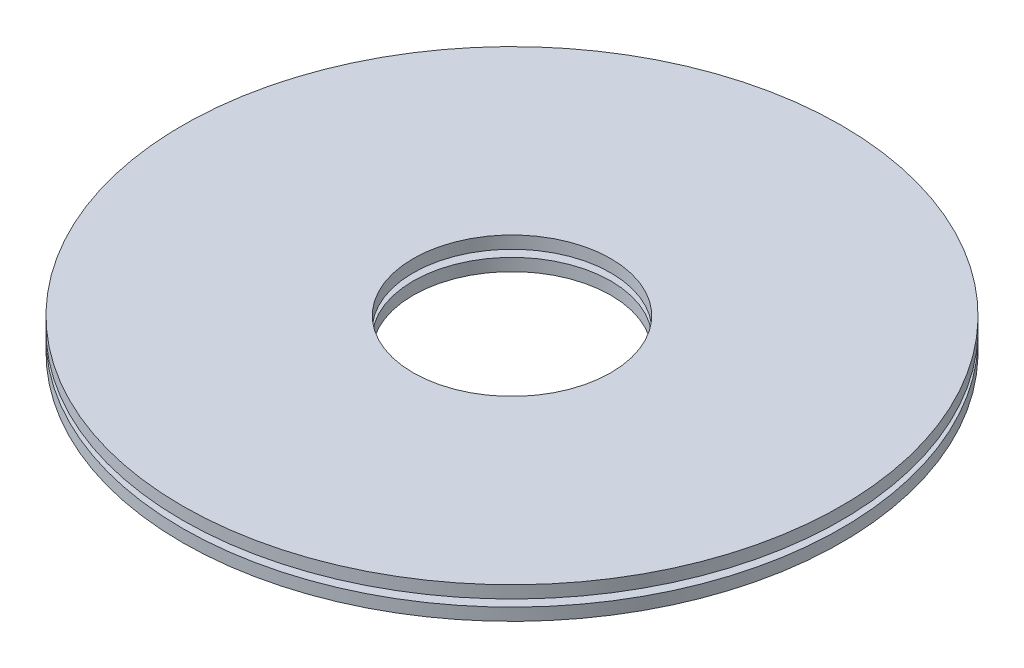
ISO-10303-21;
HEADER;
FILE_DESCRIPTION(('STEP AP214'),'2;1');
FILE_NAME('part.step','',(''),(''),'','','');
FILE_SCHEMA(('AUTOMOTIVE_DESIGN { 1 0 10303 214 1 1 1 1 }'));
ENDSEC;
DATA;
#1=APPLICATION_CONTEXT('core data for automotive mechanical design processes');
#2=APPLICATION_PROTOCOL_DEFINITION('international standard','automotive_design',2000,#1);
#3=PRODUCT_CONTEXT('',#1,'mechanical');
#4=PRODUCT('Part','Part','',(#3));
#5=PRODUCT_RELATED_PRODUCT_CATEGORY('part','',(#4));
#6=PRODUCT_DEFINITION_FORMATION('','',#4);
#7=PRODUCT_DEFINITION_CONTEXT('part definition',#1,'design');
#8=PRODUCT_DEFINITION('design','',#6,#7);
#9=PRODUCT_DEFINITION_SHAPE('','',#8);
#10=(LENGTH_UNIT() NAMED_UNIT(*) SI_UNIT(.MILLI.,.METRE.));
#11=(NAMED_UNIT(*) PLANE_ANGLE_UNIT() SI_UNIT($,.RADIAN.));
#12=(NAMED_UNIT(*) SI_UNIT($,.STERADIAN.) SOLID_ANGLE_UNIT());
#13=UNCERTAINTY_MEASURE_WITH_UNIT(LENGTH_MEASURE(1.E-05),#10,'distance_accuracy_value','');
#14=(GEOMETRIC_REPRESENTATION_CONTEXT(3) GLOBAL_UNCERTAINTY_ASSIGNED_CONTEXT((#13)) GLOBAL_UNIT_ASSIGNED_CONTEXT((#10,
#11,#12)) REPRESENTATION_CONTEXT('',''));
#15=CARTESIAN_POINT('',(0.,0.,0.));
#16=DIRECTION('',(0.,0.,1.));
#17=DIRECTION('',(1.,0.,0.));
#18=AXIS2_PLACEMENT_3D('',#15,#16,#17);
#19=CARTESIAN_POINT('',(0.,73.406,0.));
#20=DIRECTION('',(0.,-1.,0.));
#21=DIRECTION('',(0.,0.,-1.));
#22=AXIS2_PLACEMENT_3D('',#19,#20,#21);
#23=CYLINDRICAL_SURFACE('',#22,762.);
#24=CARTESIAN_POINT('',(0.,73.406,0.));
#25=DIRECTION('',(0.,1.,0.));
#26=DIRECTION('',(0.,0.,1.));
#27=AXIS2_PLACEMENT_3D('',#24,#25,#26);
#28=CIRCLE('',#27,762.);
#29=CARTESIAN_POINT('',(0.,73.406,762.));
#30=VERTEX_POINT('',#29);
#31=EDGE_CURVE('E11',#30,#30,#28,.T.);
#32=ORIENTED_EDGE('',*,*,#31,.F.);
#33=EDGE_LOOP('',(#32));
#34=FACE_BOUND('',#33,.T.);
#35=CARTESIAN_POINT('',(0.,44.831,0.));
#36=DIRECTION('',(0.,1.,0.));
#37=DIRECTION('',(0.,0.,1.));
#38=AXIS2_PLACEMENT_3D('',#35,#36,#37);
#39=CIRCLE('',#38,762.);
#40=CARTESIAN_POINT('',(0.,44.831,762.));
#41=VERTEX_POINT('',#40);
#42=EDGE_CURVE('E47',#41,#41,#39,.T.);
#43=ORIENTED_EDGE('',*,*,#42,.T.);
#44=EDGE_LOOP('',(#43));
#45=FACE_BOUND('',#44,.T.);
#46=ADVANCED_FACE('F40',(#34,#45),#23,.T.);
#47=CARTESIAN_POINT('',(0.,73.406,0.));
#48=DIRECTION('',(0.,1.,0.));
#49=DIRECTION('',(0.,0.,1.));
#50=AXIS2_PLACEMENT_3D('',#47,#48,#49);
#51=PLANE('',#50);
#52=CARTESIAN_POINT('',(0.,73.406,0.));
#53=DIRECTION('',(0.,1.,0.));
#54=DIRECTION('',(0.,0.,1.));
#55=AXIS2_PLACEMENT_3D('',#52,#53,#54);
#56=CIRCLE('',#55,228.6);
#57=CARTESIAN_POINT('',(0.,73.406,228.6));
#58=VERTEX_POINT('',#57);
#59=EDGE_CURVE('E53',#58,#58,#56,.T.);
#60=ORIENTED_EDGE('',*,*,#59,.F.);
#61=EDGE_LOOP('',(#60));
#62=FACE_BOUND('',#61,.T.);
#63=ORIENTED_EDGE('',*,*,#31,.T.);
#64=EDGE_LOOP('',(#63));
#65=FACE_BOUND('',#64,.T.);
#66=ADVANCED_FACE('F69',(#62,#65),#51,.T.);
#67=CARTESIAN_POINT('',(0.,44.831,0.));
#68=DIRECTION('',(0.,1.,0.));
#69=DIRECTION('',(0.,0.,1.));
#70=AXIS2_PLACEMENT_3D('',#67,#68,#69);
#71=PLANE('',#70);
#72=CARTESIAN_POINT('',(0.,44.831,0.));
#73=DIRECTION('',(0.,1.,0.));
#74=DIRECTION('',(0.,0.,1.));
#75=AXIS2_PLACEMENT_3D('',#72,#73,#74);
#76=CIRCLE('',#75,228.6);
#77=CARTESIAN_POINT('',(0.,44.831,228.6));
#78=VERTEX_POINT('',#77);
#79=EDGE_CURVE('E43',#78,#78,#76,.T.);
#80=ORIENTED_EDGE('',*,*,#79,.T.);
#81=EDGE_LOOP('',(#80));
#82=FACE_BOUND('',#81,.T.);
#83=ORIENTED_EDGE('',*,*,#42,.F.);
#84=EDGE_LOOP('',(#83));
#85=FACE_BOUND('',#84,.T.);
#86=ADVANCED_FACE('F60',(#82,#85),#71,.F.);
#87=CARTESIAN_POINT('',(0.,-646.578440716979,0.));
#88=DIRECTION('',(0.,1.,0.));
#89=DIRECTION('',(0.,0.,1.));
#90=AXIS2_PLACEMENT_3D('',#87,#88,#89);
#91=CYLINDRICAL_SURFACE('',#90,228.6);
#92=ORIENTED_EDGE('',*,*,#59,.T.);
#93=EDGE_LOOP('',(#92));
#94=FACE_BOUND('',#93,.T.);
#95=ORIENTED_EDGE('',*,*,#79,.F.);
#96=EDGE_LOOP('',(#95));
#97=FACE_BOUND('',#96,.T.);
#98=ADVANCED_FACE('F63',(#94,#97),#91,.F.);
#99=CLOSED_SHELL('',(#46,#66,#86,#98));
#100=MANIFOLD_SOLID_BREP('B2',#99);
#101=CARTESIAN_POINT('',(0.,28.575,0.));
#102=DIRECTION('',(0.,-1.,0.));
#103=DIRECTION('',(0.,0.,-1.));
#104=AXIS2_PLACEMENT_3D('',#101,#102,#103);
#105=CYLINDRICAL_SURFACE('',#104,762.);
#106=CARTESIAN_POINT('',(0.,28.575,0.));
#107=DIRECTION('',(0.,1.,0.));
#108=DIRECTION('',(0.,0.,1.));
#109=AXIS2_PLACEMENT_3D('',#106,#107,#108);
#110=CIRCLE('',#109,762.);
#111=CARTESIAN_POINT('',(0.,28.575,762.));
#112=VERTEX_POINT('',#111);
#113=EDGE_CURVE('E39',#112,#112,#110,.T.);
#114=ORIENTED_EDGE('',*,*,#113,.F.);
#115=EDGE_LOOP('',(#114));
#116=FACE_BOUND('',#115,.T.);
#117=CARTESIAN_POINT('',(0.,0.,0.));
#118=DIRECTION('',(0.,1.,0.));
#119=DIRECTION('',(0.,0.,1.));
#120=AXIS2_PLACEMENT_3D('',#117,#118,#119);
#121=CIRCLE('',#120,762.);
#122=CARTESIAN_POINT('',(0.,0.,762.));
#123=VERTEX_POINT('',#122);
#124=EDGE_CURVE('E104',#123,#123,#121,.T.);
#125=ORIENTED_EDGE('',*,*,#124,.T.);
#126=EDGE_LOOP('',(#125));
#127=FACE_BOUND('',#126,.T.);
#128=ADVANCED_FACE('F101',(#116,#127),#105,.T.);
#129=CARTESIAN_POINT('',(0.,28.575,0.));
#130=DIRECTION('',(0.,1.,0.));
#131=DIRECTION('',(0.,0.,1.));
#132=AXIS2_PLACEMENT_3D('',#129,#130,#131);
#133=PLANE('',#132);
#134=CARTESIAN_POINT('',(0.,28.575,0.));
#135=DIRECTION('',(0.,1.,0.));
#136=DIRECTION('',(0.,0.,1.));
#137=AXIS2_PLACEMENT_3D('',#134,#135,#136);
#138=CIRCLE('',#137,228.6);
#139=CARTESIAN_POINT('',(0.,28.575,228.6));
#140=VERTEX_POINT('',#139);
#141=EDGE_CURVE('E111',#140,#140,#138,.T.);
#142=ORIENTED_EDGE('',*,*,#141,.F.);
#143=EDGE_LOOP('',(#142));
#144=FACE_BOUND('',#143,.T.);
#145=ORIENTED_EDGE('',*,*,#113,.T.);
#146=EDGE_LOOP('',(#145));
#147=FACE_BOUND('',#146,.T.);
#148=ADVANCED_FACE('F124',(#144,#147),#133,.T.);
#149=CARTESIAN_POINT('',(0.,0.,0.));
#150=DIRECTION('',(0.,1.,0.));
#151=DIRECTION('',(0.,0.,1.));
#152=AXIS2_PLACEMENT_3D('',#149,#150,#151);
#153=PLANE('',#152);
#154=CARTESIAN_POINT('',(0.,0.,0.));
#155=DIRECTION('',(0.,1.,0.));
#156=DIRECTION('',(0.,0.,1.));
#157=AXIS2_PLACEMENT_3D('',#154,#155,#156);
#158=CIRCLE('',#157,228.6);
#159=CARTESIAN_POINT('',(0.,0.,228.6));
#160=VERTEX_POINT('',#159);
#161=EDGE_CURVE('E115',#160,#160,#158,.F.);
#162=ORIENTED_EDGE('',*,*,#161,.F.);
#163=EDGE_LOOP('',(#162));
#164=FACE_BOUND('',#163,.T.);
#165=ORIENTED_EDGE('',*,*,#124,.F.);
#166=EDGE_LOOP('',(#165));
#167=FACE_BOUND('',#166,.T.);
#168=ADVANCED_FACE('F121',(#164,#167),#153,.F.);
#169=CARTESIAN_POINT('',(0.,-646.578440716979,0.));
#170=DIRECTION('',(0.,1.,0.));
#171=DIRECTION('',(0.,0.,1.));
#172=AXIS2_PLACEMENT_3D('',#169,#170,#171);
#173=CYLINDRICAL_SURFACE('',#172,228.6);
#174=ORIENTED_EDGE('',*,*,#141,.T.);
#175=EDGE_LOOP('',(#174));
#176=FACE_BOUND('',#175,.T.);
#177=ORIENTED_EDGE('',*,*,#161,.T.);
#178=EDGE_LOOP('',(#177));
#179=FACE_BOUND('',#178,.T.);
#180=ADVANCED_FACE('F119',(#176,#179),#173,.F.);
#181=CLOSED_SHELL('',(#128,#148,#168,#180));
#182=MANIFOLD_SOLID_BREP('B6',#181);
#183=ADVANCED_BREP_SHAPE_REPRESENTATION('',(#18,#100,#182),#14);
#184=SHAPE_DEFINITION_REPRESENTATION(#9,#183);
ENDSEC;
END-ISO-10303-21;
